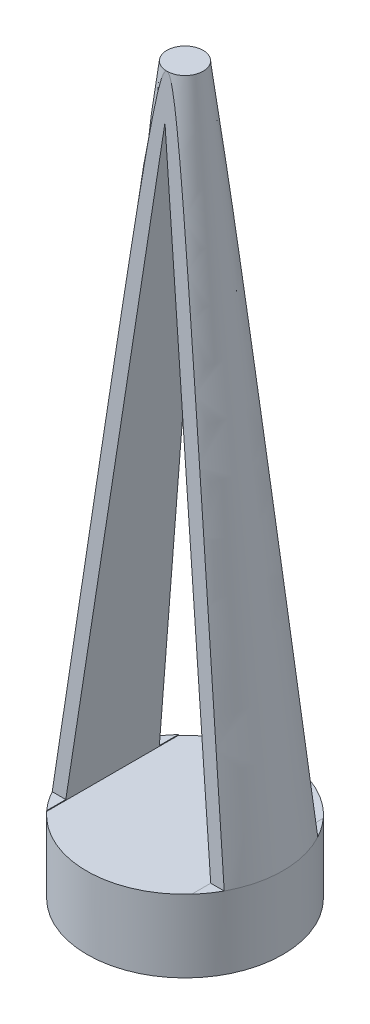
ISO-10303-21;
HEADER;
FILE_DESCRIPTION(('STEP AP214'),'2;1');
FILE_NAME('part.step','',(''),(''),'','','');
FILE_SCHEMA(('AUTOMOTIVE_DESIGN { 1 0 10303 214 1 1 1 1 }'));
ENDSEC;
DATA;
#1=APPLICATION_CONTEXT('core data for automotive mechanical design processes');
#2=APPLICATION_PROTOCOL_DEFINITION('international standard','automotive_design',2000,#1);
#3=PRODUCT_CONTEXT('',#1,'mechanical');
#4=PRODUCT('Part','Part','',(#3));
#5=PRODUCT_RELATED_PRODUCT_CATEGORY('part','',(#4));
#6=PRODUCT_DEFINITION_FORMATION('','',#4);
#7=PRODUCT_DEFINITION_CONTEXT('part definition',#1,'design');
#8=PRODUCT_DEFINITION('design','',#6,#7);
#9=PRODUCT_DEFINITION_SHAPE('','',#8);
#10=(LENGTH_UNIT() NAMED_UNIT(*) SI_UNIT(.MILLI.,.METRE.));
#11=(NAMED_UNIT(*) PLANE_ANGLE_UNIT() SI_UNIT($,.RADIAN.));
#12=(NAMED_UNIT(*) SI_UNIT($,.STERADIAN.) SOLID_ANGLE_UNIT());
#13=UNCERTAINTY_MEASURE_WITH_UNIT(LENGTH_MEASURE(1.E-05),#10,'distance_accuracy_value','');
#14=(GEOMETRIC_REPRESENTATION_CONTEXT(3) GLOBAL_UNCERTAINTY_ASSIGNED_CONTEXT((#13)) GLOBAL_UNIT_ASSIGNED_CONTEXT((#10,
#11,#12)) REPRESENTATION_CONTEXT('',''));
#15=CARTESIAN_POINT('',(0.,0.,0.));
#16=DIRECTION('',(0.,0.,1.));
#17=DIRECTION('',(1.,0.,0.));
#18=AXIS2_PLACEMENT_3D('',#15,#16,#17);
#19=CARTESIAN_POINT('',(-13.5,10.,-29.4519829234393));
#20=DIRECTION('',(0.,-1.,0.));
#21=DIRECTION('',(0.,0.,-1.));
#22=AXIS2_PLACEMENT_3D('',#19,#20,#21);
#23=PLANE('',#22);
#24=DIRECTION('',(1.,0.,0.));
#25=VECTOR('',#24,1.);
#26=CARTESIAN_POINT('',(-13.5,10.,-6.45198292343925));
#27=LINE('',#26,#25);
#28=CARTESIAN_POINT('',(-11.8584112070567,10.,-6.45198292343925));
#29=VERTEX_POINT('',#28);
#30=CARTESIAN_POINT('',(-9.98661612270126,10.,-6.45198292343925));
#31=VERTEX_POINT('',#30);
#32=EDGE_CURVE('E184',#29,#31,#27,.T.);
#33=ORIENTED_EDGE('',*,*,#32,.T.);
#34=DIRECTION('',(0.,0.,-1.));
#35=VECTOR('',#34,1.);
#36=CARTESIAN_POINT('',(-9.98661612270127,10.,-29.4519829234393));
#37=LINE('',#36,#35);
#38=CARTESIAN_POINT('',(-9.98661612270127,10.,-9.08391426741815));
#39=VERTEX_POINT('',#38);
#40=EDGE_CURVE('E221',#31,#39,#37,.T.);
#41=ORIENTED_EDGE('',*,*,#40,.T.);
#42=CARTESIAN_POINT('',(0.,10.,0.));
#43=DIRECTION('',(0.,-1.,0.));
#44=DIRECTION('',(0.,0.,-1.));
#45=AXIS2_PLACEMENT_3D('',#42,#43,#44);
#46=CIRCLE('',#45,13.5);
#47=EDGE_CURVE('E137',#29,#39,#46,.T.);
#48=ORIENTED_EDGE('',*,*,#47,.F.);
#49=EDGE_LOOP('',(#33,#41,#48));
#50=FACE_BOUND('',#49,.T.);
#51=ADVANCED_FACE('F43',(#50),#23,.F.);
#52=CARTESIAN_POINT('',(-13.5,10.,29.4519829234393));
#53=DIRECTION('',(0.,-1.,0.));
#54=DIRECTION('',(0.,0.,-1.));
#55=AXIS2_PLACEMENT_3D('',#52,#53,#54);
#56=PLANE('',#55);
#57=CARTESIAN_POINT('',(-9.98661612270127,10.,9.08391426741815));
#58=VERTEX_POINT('',#57);
#59=CARTESIAN_POINT('',(-11.8584112070567,10.,6.45198292343925));
#60=VERTEX_POINT('',#59);
#61=EDGE_CURVE('E140',#58,#60,#46,.T.);
#62=ORIENTED_EDGE('',*,*,#61,.F.);
#63=DIRECTION('',(0.,0.,-1.));
#64=VECTOR('',#63,1.);
#65=CARTESIAN_POINT('',(-9.98661612270127,10.,29.4519829234393));
#66=LINE('',#65,#64);
#67=CARTESIAN_POINT('',(-9.98661612270127,10.,6.45198292343925));
#68=VERTEX_POINT('',#67);
#69=EDGE_CURVE('E11',#58,#68,#66,.T.);
#70=ORIENTED_EDGE('',*,*,#69,.T.);
#71=DIRECTION('',(1.,0.,0.));
#72=VECTOR('',#71,1.);
#73=CARTESIAN_POINT('',(-13.5,10.,6.45198292343925));
#74=LINE('',#73,#72);
#75=EDGE_CURVE('E171',#60,#68,#74,.T.);
#76=ORIENTED_EDGE('',*,*,#75,.F.);
#77=EDGE_LOOP('',(#62,#70,#76));
#78=FACE_BOUND('',#77,.T.);
#79=ADVANCED_FACE('F214',(#78),#56,.F.);
#80=CARTESIAN_POINT('',(0.,100.,0.));
#81=DIRECTION('',(0.,-1.,0.));
#82=DIRECTION('',(0.,0.,-1.));
#83=AXIS2_PLACEMENT_3D('',#80,#81,#82);
#84=CONICAL_SURFACE('',#83,2.5,0.121619023261347);
#85=EDGE_CURVE('E142',#60,#29,#46,.T.);
#86=ORIENTED_EDGE('',*,*,#85,.F.);
#87=CARTESIAN_POINT('',(-11.8584342571506,9.9998,6.45199170562352));
#88=CARTESIAN_POINT('',(-11.6285408480214,11.9945069191554,6.36440228693721));
#89=CARTESIAN_POINT('',(-11.3985168669059,13.9891988268268,6.27681352741899));
#90=CARTESIAN_POINT('',(-10.9381327907331,17.9786383406804,6.10163356260962));
#91=CARTESIAN_POINT('',(-10.7077726804772,19.973385945112,6.01404235739534));
#92=CARTESIAN_POINT('',(-10.2474197232843,23.9562877971518,5.83914946733983));
#93=CARTESIAN_POINT('',(-10.0174281533141,25.9444421920318,5.75184777603176));
#94=CARTESIAN_POINT('',(-9.55697719471043,29.9206032342618,5.57725088114579));
#95=CARTESIAN_POINT('',(-9.32651782832233,31.9086098841836,5.48995567745496));
#96=CARTESIAN_POINT('',(-8.67837746132275,37.4924836504869,5.24476263555417));
#97=CARTESIAN_POINT('',(-8.26003349439677,41.0882740672214,5.08686816529638));
#98=CARTESIAN_POINT('',(-7.63023601028722,46.4820170177257,4.85002394269845));
#99=CARTESIAN_POINT('',(-7.41990451208157,48.2801002984779,4.77106844913784));
#100=CARTESIAN_POINT('',(-6.9982687357099,51.8761489496317,4.61316263956877));
#101=CARTESIAN_POINT('',(-6.78696445974724,53.6741143202909,4.53421232354899));
#102=CARTESIAN_POINT('',(-6.36199535206681,57.2790837030713,4.37591479643488));
#103=CARTESIAN_POINT('',(-6.14832397532452,59.0860869454905,4.29656761913889));
#104=CARTESIAN_POINT('',(-5.71922936018165,62.6999016715271,4.13788168485255));
#105=CARTESIAN_POINT('',(-5.50380610686704,64.5067131533792,4.05854292793974));
#106=CARTESIAN_POINT('',(-5.07063502718311,68.118827562796,3.89993165612281));
#107=CARTESIAN_POINT('',(-4.85288885882153,69.9241306886695,3.82065913251076));
#108=CARTESIAN_POINT('',(-4.41378265301205,73.5342435673284,3.66213574975356));
#109=CARTESIAN_POINT('',(-4.19242272698438,75.3390533335871,3.58288489001677));
#110=CARTESIAN_POINT('',(-3.85566042407418,78.0487620551712,3.4638990834035));
#111=CARTESIAN_POINT('',(-3.74242592382784,78.9539297306058,3.42415233677943));
#112=CARTESIAN_POINT('',(-3.51401970206015,80.7641039962184,3.34466591693332));
#113=CARTESIAN_POINT('',(-3.39884780785029,81.6691105646925,3.30492624466431));
#114=CARTESIAN_POINT('',(-3.16566944592479,83.480690558555,3.22537809799555));
#115=CARTESIAN_POINT('',(-3.04765753617785,84.3872632857954,3.18556965425211));
#116=CARTESIAN_POINT('',(-2.80803882862327,86.1996607524699,3.10598561159897));
#117=CARTESIAN_POINT('',(-2.68643311929754,87.1054856346751,3.06621000642007));
#118=CARTESIAN_POINT('',(-2.50062685684623,88.4587839389358,3.00678543098943));
#119=CARTESIAN_POINT('',(-2.43847484233686,88.9065378665049,2.98712414348214));
#120=CARTESIAN_POINT('',(-2.31249078210079,89.8018272865451,2.94781116015398));
#121=CARTESIAN_POINT('',(-2.24865867379907,90.2493627702462,2.9281594647182));
#122=CARTESIAN_POINT('',(-2.11877749243549,91.1446225470556,2.88884778305161));
#123=CARTESIAN_POINT('',(-2.05272602945693,91.5923464953287,2.86918781196284));
#124=CARTESIAN_POINT('',(-1.91778233647481,92.4873078072887,2.82988923616278));
#125=CARTESIAN_POINT('',(-1.84889048119476,92.9345452272219,2.81025062898168));
#126=CARTESIAN_POINT('',(-1.70749613503853,93.8264924398709,2.77108440505948));
#127=CARTESIAN_POINT('',(-1.63501037896266,94.2712048521742,2.75155667328988));
#128=CARTESIAN_POINT('',(-1.52196367177021,94.9376598614447,2.72229201978013));
#129=CARTESIAN_POINT('',(-1.48355140640092,95.1597658465747,2.71253914133094));
#130=CARTESIAN_POINT('',(-1.40491521708824,95.6036500027683,2.69304777905024));
#131=CARTESIAN_POINT('',(-1.3646913647335,95.8254281864286,2.68330929466561));
#132=CARTESIAN_POINT('',(-1.28199748194456,96.2680903639752,2.6638715905932));
#133=CARTESIAN_POINT('',(-1.23953229637111,96.4889752582893,2.65417233136682));
#134=CARTESIAN_POINT('',(-1.15149066699462,96.9301690618391,2.63479910494953));
#135=CARTESIAN_POINT('',(-1.10591373704144,97.1504778754652,2.62512514195693));
#136=CARTESIAN_POINT('',(-1.01038935068411,97.5899503824088,2.60582749925958));
#137=CARTESIAN_POINT('',(-0.960445677782289,97.8091148960627,2.59620378353309));
#138=CARTESIAN_POINT('',(-0.853918418984521,98.2458176465807,2.57702776339235));
#139=CARTESIAN_POINT('',(-0.797337200733368,98.463356434074,2.56747543479947));
#140=CARTESIAN_POINT('',(-0.72428678025953,98.7153022999458,2.55641225969329));
#141=CARTESIAN_POINT('',(-0.713641129294059,98.7513905164255,2.55482759285701));
#142=CARTESIAN_POINT('',(-0.691952134781309,98.8234489523897,2.55166344054123));
#143=CARTESIAN_POINT('',(-0.680908776681683,98.8594191675037,2.55008395525364));
#144=CARTESIAN_POINT('',(-0.647097148272669,98.9671626079836,2.54535284151043));
#145=CARTESIAN_POINT('',(-0.623659121844415,99.0387274855673,2.54221036179788));
#146=CARTESIAN_POINT('',(-0.57412687294838,99.1818406695297,2.53592613002968));
#147=CARTESIAN_POINT('',(-0.548006098347438,99.2533800073746,2.5327847717906));
#148=CARTESIAN_POINT('',(-0.492306555973057,99.3949861190377,2.52656671695563));
#149=CARTESIAN_POINT('',(-0.462732407240674,99.4650547152573,2.52348994033642));
#150=CARTESIAN_POINT('',(-0.39767272984239,99.6040190072779,2.51738789023605));
#151=CARTESIAN_POINT('',(-0.362097833829897,99.6728763579273,2.51436430052583));
#152=CARTESIAN_POINT('',(-0.301257468105687,99.7709181480175,2.51005919519005));
#153=CARTESIAN_POINT('',(-0.279918756372832,99.8025063346347,2.50867212881123));
#154=CARTESIAN_POINT('',(-0.233496548336692,99.8627557307301,2.50602652231661));
#155=CARTESIAN_POINT('',(-0.208435436411657,99.8914328199158,2.50476728490821));
#156=CARTESIAN_POINT('',(-0.169713127804961,99.9269025624142,2.50320977583429));
#157=CARTESIAN_POINT('',(-0.158497162325428,99.9363232852227,2.50279610321578));
#158=CARTESIAN_POINT('',(-0.135035967100917,99.9538525065294,2.50202637895728));
#159=CARTESIAN_POINT('',(-0.122789330666709,99.9619591659418,2.50167040807324));
#160=CARTESIAN_POINT('',(-0.0970342477735006,99.9763984548121,2.50103636559499));
#161=CARTESIAN_POINT('',(-0.083510609018077,99.9827048170474,2.50075944741874));
#162=CARTESIAN_POINT('',(-0.0555105771865756,99.9926257436817,2.50032381038937));
#163=CARTESIAN_POINT('',(-0.0410374085742732,99.9962489520258,2.50016471197266));
#164=CARTESIAN_POINT('',(-0.0151389908621096,99.9997366238917,2.50001156508758));
#165=CARTESIAN_POINT('',(-0.00380598946014141,100.000289285298,2.49998729721601));
#166=CARTESIAN_POINT('',(0.018785679637718,99.9994241786875,2.50002528484438));
#167=CARTESIAN_POINT('',(0.0300443369705516,99.9980061415602,2.50008755216118));
#168=CARTESIAN_POINT('',(0.0521111669882821,99.9933762495125,2.50029085498684));
#169=CARTESIAN_POINT('',(0.0629214370777905,99.9901740845759,2.50043146499959));
#170=CARTESIAN_POINT('',(0.0839768223260764,99.982282982852,2.50077797054692));
#171=CARTESIAN_POINT('',(0.0942215534646088,99.9775930500511,2.50098390981738));
#172=CARTESIAN_POINT('',(0.121856701870732,99.962923181784,2.50162807724939));
#173=CARTESIAN_POINT('',(0.138567333635558,99.9516751189981,2.50212199004996));
#174=CARTESIAN_POINT('',(0.170164400017073,99.9268566695979,2.50321179103014));
#175=CARTESIAN_POINT('',(0.185043640504509,99.9132775966435,2.50380806063494));
#176=CARTESIAN_POINT('',(0.238408080709174,99.8594492947993,2.50617171096478));
#177=CARTESIAN_POINT('',(0.272054333219058,99.8145404225363,2.50814370092361));
#178=CARTESIAN_POINT('',(0.333441317838563,99.7208810119222,2.51225637193879));
#179=CARTESIAN_POINT('',(0.361137650452189,99.6721050739159,2.51439816831741));
#180=CARTESIAN_POINT('',(0.414863503217922,99.5685266898205,2.51894639059721));
#181=CARTESIAN_POINT('',(0.440573609760954,99.5135569417164,2.52136016288402));
#182=CARTESIAN_POINT('',(0.489085745937005,99.4023389887671,2.52624384567109));
#183=CARTESIAN_POINT('',(0.511885028996051,99.3460896346141,2.5287138066385));
#184=CARTESIAN_POINT('',(0.577299577011346,99.1759085485072,2.53618661492947));
#185=CARTESIAN_POINT('',(0.616814713172568,99.0607923384259,2.54124147377893));
#186=CARTESIAN_POINT('',(0.691042301670075,98.8289698436222,2.55142101312042));
#187=CARTESIAN_POINT('',(0.725750185828485,98.7122621606699,2.55654575500999));
#188=CARTESIAN_POINT('',(0.791802912239096,98.4780989960488,2.56682807531978));
#189=CARTESIAN_POINT('',(0.823152878399683,98.3606449520109,2.5719855906123));
#190=CARTESIAN_POINT('',(0.91305583806449,98.009856828207,2.58738902033472));
#191=CARTESIAN_POINT('',(0.968191147609912,97.775656825406,2.59767295824293));
#192=CARTESIAN_POINT('',(1.07296469282629,97.3060186777441,2.618295202018));
#193=CARTESIAN_POINT('',(1.1226018902829,97.0705803078033,2.62863351776831));
#194=CARTESIAN_POINT('',(1.21814593003481,96.5986869542158,2.64935478971345));
#195=CARTESIAN_POINT('',(1.26404866859506,96.3622311449885,2.65973778216027));
#196=CARTESIAN_POINT('',(1.35310673664148,95.8888276954807,2.68052536380863));
#197=CARTESIAN_POINT('',(1.39626228739751,95.6518800964024,2.69092995120094));
#198=CARTESIAN_POINT('',(1.48039389017522,95.1781206368491,2.71173316557841));
#199=CARTESIAN_POINT('',(1.52137438656278,94.941309561307,2.72213175809645));
#200=CARTESIAN_POINT('',(1.60169850014491,94.4674065773131,2.74294127476434));
#201=CARTESIAN_POINT('',(1.64104208456994,94.2303146633368,2.75335219915679));
#202=CARTESIAN_POINT('',(1.71838662039047,93.7560386932564,2.7741780939874));
#203=CARTESIAN_POINT('',(1.75638825559499,93.5188547482095,2.78459305954895));
#204=CARTESIAN_POINT('',(1.83130005693493,93.0443171542799,2.80543044252384));
#205=CARTESIAN_POINT('',(1.86821023153121,92.8069635067274,2.81585285987876));
#206=CARTESIAN_POINT('',(1.9774660158891,92.0954332101122,2.84709681078691));
#207=CARTESIAN_POINT('',(2.04845604826969,91.6210488030337,2.86792746718602));
#208=CARTESIAN_POINT('',(2.18779407600312,90.671892121929,2.90960581157929));
#209=CARTESIAN_POINT('',(2.25614205437892,90.1971198454305,2.930453499682));
#210=CARTESIAN_POINT('',(2.45820641614634,88.7723615940312,2.99301594723266));
#211=CARTESIAN_POINT('',(2.58894025326383,87.8219539672511,3.03474922180312));
#212=CARTESIAN_POINT('',(2.84548289605772,85.9202269357448,3.11825580795374));
#213=CARTESIAN_POINT('',(2.97129039569663,84.9689073568187,3.16002912718317));
#214=CARTESIAN_POINT('',(3.21949621059495,83.0658368292434,3.24359470748404));
#215=CARTESIAN_POINT('',(3.34189456715148,82.1140858859616,3.28538696831979));
#216=CARTESIAN_POINT('',(3.5843118856437,80.2098137408085,3.36900531275563));
#217=CARTESIAN_POINT('',(3.70432966569164,79.2572923891818,3.41083140293163));
#218=CARTESIAN_POINT('',(3.94253944513253,77.3520191744001,3.49449370525723));
#219=CARTESIAN_POINT('',(4.06073143892861,76.3992673105476,3.53632991743745));
#220=CARTESIAN_POINT('',(4.41320503374214,73.540952336915,3.66184116149975));
#221=CARTESIAN_POINT('',(4.6454090112968,71.6351337299524,3.74552741249851));
#222=CARTESIAN_POINT('',(5.16248995580306,67.3589309000977,3.93329941872905));
#223=CARTESIAN_POINT('',(5.44642385673114,64.9884332240238,4.03739015579457));
#224=CARTESIAN_POINT('',(6.01097919642145,60.2470427833411,4.24558897862719));
#225=CARTESIAN_POINT('',(6.29160063230283,57.8761500183906,4.3496970644093));
#226=CARTESIAN_POINT('',(6.85064303092841,53.13401910378,4.55792840213435));
#227=CARTESIAN_POINT('',(7.12906391391702,50.7627809447451,4.66205165448894));
#228=CARTESIAN_POINT('',(7.68435153964632,46.0201229453935,4.87030613699061));
#229=CARTESIAN_POINT('',(7.96121828226833,43.648703105063,4.97443736713829));
#230=CARTESIAN_POINT('',(8.79003796641072,36.535193176843,5.28679814227208));
#231=CARTESIAN_POINT('',(9.34032121507048,31.7929089926743,5.49503621020464));
#232=CARTESIAN_POINT('',(10.4383344331721,22.3080847056459,5.91152358369529));
#233=CARTESIAN_POINT('',(10.9860644231462,17.5655446051555,6.11977288914934));
#234=CARTESIAN_POINT('',(11.5872338470483,12.352397691803,6.34868697335988));
#235=CARTESIAN_POINT('',(11.641484330945,11.8818841929439,6.36934765461253));
#236=CARTESIAN_POINT('',(11.7499705106425,10.9408474226328,6.4106694462414));
#237=CARTESIAN_POINT('',(11.8042062061774,10.4703241511504,6.43133055661895));
#238=CARTESIAN_POINT('',(11.8584342571506,9.9998,6.45199170562352));
#239=B_SPLINE_CURVE_WITH_KNOTS('',3,(#87,#88,#89,#90,#91,#92,#93,#94,#95,#96,#97,#98,#99,#100,
#101,#102,#103,#104,#105,#106,#107,#108,#109,#110,#111,#112,#113,#114,#115,#116,#117,#118,#119,
#120,#121,#122,#123,#124,#125,#126,#127,#128,#129,#130,#131,#132,#133,#134,#135,#136,#137,#138,
#139,#140,#141,#142,#143,#144,#145,#146,#147,#148,#149,#150,#151,#152,#153,#154,#155,#156,#157,
#158,#159,#160,#161,#162,#163,#164,#165,#166,#167,#168,#169,#170,#171,#172,#173,#174,#175,#176,
#177,#178,#179,#180,#181,#182,#183,#184,#185,#186,#187,#188,#189,#190,#191,#192,#193,#194,#195,
#196,#197,#198,#199,#200,#201,#202,#203,#204,#205,#206,#207,#208,#209,#210,#211,#212,#213,#214,
#215,#216,#217,#218,#219,#220,#221,#222,#223,#224,#225,#226,#227,#228,#229,#230,#231,#232,#233,
#234,#235,#236,#237,#238),.UNSPECIFIED.,.F.,.F.,(4,2,2,2,2,2,2,2,2,2,2,2,2,2,2,2,2,2,2,2,2,2,2,
2,2,2,2,2,2,2,2,2,2,2,2,2,2,2,2,2,2,2,2,2,2,2,2,2,2,2,2,2,2,2,2,2,2,2,2,2,2,2,2,2,2,2,2,2,2,2,2,
2,2,2,2,4),(0.,6.0294616086733,12.0592048649111,18.0691532608147,24.0788222603635,
34.9492793699482,40.3854718898463,45.8216521026621,51.2856161494098,56.7496267606028,
62.2099684560234,67.6701421136806,70.4094057997221,73.1489149560203,75.8941739761178,
78.6386098720322,79.9960304718524,81.3535017004754,82.7124847812964,84.0712891461148,
85.4242715879971,86.1011082355621,86.777918159937,87.4533206601439,88.1288289215156,
88.8037575909489,89.4784462379238,89.5914211965834,89.7044002932739,89.9304869693796,
90.1590785676903,90.3873678432629,90.6194183947717,90.7337369824873,90.8473940460538,
90.8912842122446,90.935235283848,90.979798196729,91.0242169153604,91.058089074393,
91.0919658593145,91.1256604208414,91.1593775875861,91.2194722595868,91.2797959343182,
91.4469056333957,91.6152220661747,91.7972454592715,91.9794393549186,92.3446494326485,
92.7102042111081,93.0751929883613,93.7975309224952,94.520005024771,95.243262609656,
95.9664618664845,96.6881214967129,97.4097955669877,98.1310964298531,98.8523916998197,
100.292736327699,101.733090209256,104.613858003556,107.495384427095,110.376875929677,
113.25976390622,116.142660718389,121.907860766028,129.076986523246,136.246118515005,
143.415509160113,150.584900352644,164.920829497687,179.256643159768,180.67888659268,
182.101154102895),.UNSPECIFIED.);
#240=CARTESIAN_POINT('',(0.,100.,2.5));
#241=VERTEX_POINT('',#240);
#242=EDGE_CURVE('E144',#60,#241,#239,.T.);
#243=ORIENTED_EDGE('',*,*,#242,.T.);
#244=CARTESIAN_POINT('',(0.,100.,0.));
#245=DIRECTION('',(0.,-1.,0.));
#246=DIRECTION('',(0.,0.,-1.));
#247=AXIS2_PLACEMENT_3D('',#244,#245,#246);
#248=CIRCLE('',#247,2.5);
#249=CARTESIAN_POINT('',(0.,100.,-2.5));
#250=VERTEX_POINT('',#249);
#251=EDGE_CURVE('E148',#241,#250,#248,.T.);
#252=ORIENTED_EDGE('',*,*,#251,.T.);
#253=CARTESIAN_POINT('',(11.8584342571506,9.9998,-6.45199170562352));
#254=CARTESIAN_POINT('',(11.6285408480214,11.9945069191554,-6.36440228693721));
#255=CARTESIAN_POINT('',(11.3985168669059,13.9891988268268,-6.27681352741899));
#256=CARTESIAN_POINT('',(10.9381327907331,17.9786383406804,-6.10163356260962));
#257=CARTESIAN_POINT('',(10.7077726804772,19.973385945112,-6.01404235739534));
#258=CARTESIAN_POINT('',(10.2474197232843,23.9562877971518,-5.83914946733983));
#259=CARTESIAN_POINT('',(10.0174281533141,25.9444421920318,-5.75184777603176));
#260=CARTESIAN_POINT('',(9.55697719471043,29.9206032342618,-5.57725088114579));
#261=CARTESIAN_POINT('',(9.32651782832233,31.9086098841836,-5.48995567745496));
#262=CARTESIAN_POINT('',(8.67837746132275,37.4924836504869,-5.24476263555417));
#263=CARTESIAN_POINT('',(8.26003349439677,41.0882740672214,-5.08686816529638));
#264=CARTESIAN_POINT('',(7.63023601028722,46.4820170177257,-4.85002394269845));
#265=CARTESIAN_POINT('',(7.41990451208157,48.2801002984779,-4.77106844913784));
#266=CARTESIAN_POINT('',(6.9982687357099,51.8761489496317,-4.61316263956877));
#267=CARTESIAN_POINT('',(6.78696445974724,53.6741143202909,-4.53421232354899));
#268=CARTESIAN_POINT('',(6.36199535206681,57.2790837030713,-4.37591479643488));
#269=CARTESIAN_POINT('',(6.14832397532452,59.0860869454905,-4.29656761913889));
#270=CARTESIAN_POINT('',(5.71922936018165,62.6999016715271,-4.13788168485255));
#271=CARTESIAN_POINT('',(5.50380610686704,64.5067131533792,-4.05854292793974));
#272=CARTESIAN_POINT('',(5.07063502718311,68.118827562796,-3.89993165612281));
#273=CARTESIAN_POINT('',(4.85288885882153,69.9241306886695,-3.82065913251076));
#274=CARTESIAN_POINT('',(4.41378265301205,73.5342435673284,-3.66213574975356));
#275=CARTESIAN_POINT('',(4.19242272698438,75.3390533335871,-3.58288489001677));
#276=CARTESIAN_POINT('',(3.85566042407418,78.0487620551712,-3.4638990834035));
#277=CARTESIAN_POINT('',(3.74242592382784,78.9539297306058,-3.42415233677943));
#278=CARTESIAN_POINT('',(3.51401970206015,80.7641039962184,-3.34466591693332));
#279=CARTESIAN_POINT('',(3.39884780785029,81.6691105646925,-3.30492624466431));
#280=CARTESIAN_POINT('',(3.16566944592479,83.480690558555,-3.22537809799555));
#281=CARTESIAN_POINT('',(3.04765753617785,84.3872632857954,-3.18556965425211));
#282=CARTESIAN_POINT('',(2.80803882862327,86.1996607524699,-3.10598561159897));
#283=CARTESIAN_POINT('',(2.68643311929754,87.1054856346751,-3.06621000642007));
#284=CARTESIAN_POINT('',(2.50062685684623,88.4587839389358,-3.00678543098943));
#285=CARTESIAN_POINT('',(2.43847484233686,88.9065378665049,-2.98712414348214));
#286=CARTESIAN_POINT('',(2.31249078210079,89.8018272865451,-2.94781116015398));
#287=CARTESIAN_POINT('',(2.24865867379907,90.2493627702462,-2.9281594647182));
#288=CARTESIAN_POINT('',(2.11877749243549,91.1446225470556,-2.88884778305161));
#289=CARTESIAN_POINT('',(2.05272602945693,91.5923464953287,-2.86918781196284));
#290=CARTESIAN_POINT('',(1.91778233647481,92.4873078072887,-2.82988923616278));
#291=CARTESIAN_POINT('',(1.84889048119476,92.9345452272219,-2.81025062898168));
#292=CARTESIAN_POINT('',(1.70749613503853,93.8264924398709,-2.77108440505948));
#293=CARTESIAN_POINT('',(1.63501037896266,94.2712048521742,-2.75155667328988));
#294=CARTESIAN_POINT('',(1.52196367177021,94.9376598614447,-2.72229201978013));
#295=CARTESIAN_POINT('',(1.48355140640092,95.1597658465747,-2.71253914133094));
#296=CARTESIAN_POINT('',(1.40491521708824,95.6036500027683,-2.69304777905024));
#297=CARTESIAN_POINT('',(1.3646913647335,95.8254281864286,-2.68330929466561));
#298=CARTESIAN_POINT('',(1.28199748194456,96.2680903639752,-2.6638715905932));
#299=CARTESIAN_POINT('',(1.23953229637111,96.4889752582893,-2.65417233136682));
#300=CARTESIAN_POINT('',(1.15149066699462,96.9301690618391,-2.63479910494953));
#301=CARTESIAN_POINT('',(1.10591373704144,97.1504778754652,-2.62512514195693));
#302=CARTESIAN_POINT('',(1.01038935068411,97.5899503824088,-2.60582749925958));
#303=CARTESIAN_POINT('',(0.960445677782289,97.8091148960627,-2.59620378353309));
#304=CARTESIAN_POINT('',(0.853918418984521,98.2458176465807,-2.57702776339235));
#305=CARTESIAN_POINT('',(0.797337200733368,98.463356434074,-2.56747543479947));
#306=CARTESIAN_POINT('',(0.72428678025953,98.7153022999458,-2.55641225969329));
#307=CARTESIAN_POINT('',(0.713641129294059,98.7513905164255,-2.55482759285701));
#308=CARTESIAN_POINT('',(0.691952134781309,98.8234489523897,-2.55166344054123));
#309=CARTESIAN_POINT('',(0.680908776681683,98.8594191675037,-2.55008395525364));
#310=CARTESIAN_POINT('',(0.647097148272669,98.9671626079836,-2.54535284151043));
#311=CARTESIAN_POINT('',(0.623659121844415,99.0387274855673,-2.54221036179788));
#312=CARTESIAN_POINT('',(0.57412687294838,99.1818406695297,-2.53592613002968));
#313=CARTESIAN_POINT('',(0.548006098347438,99.2533800073746,-2.5327847717906));
#314=CARTESIAN_POINT('',(0.492306555973057,99.3949861190377,-2.52656671695563));
#315=CARTESIAN_POINT('',(0.462732407240674,99.4650547152573,-2.52348994033642));
#316=CARTESIAN_POINT('',(0.39767272984239,99.6040190072779,-2.51738789023605));
#317=CARTESIAN_POINT('',(0.362097833829897,99.6728763579273,-2.51436430052583));
#318=CARTESIAN_POINT('',(0.301257468105687,99.7709181480175,-2.51005919519005));
#319=CARTESIAN_POINT('',(0.279918756372832,99.8025063346347,-2.50867212881123));
#320=CARTESIAN_POINT('',(0.233496548336692,99.8627557307301,-2.50602652231661));
#321=CARTESIAN_POINT('',(0.208435436411657,99.8914328199158,-2.50476728490821));
#322=CARTESIAN_POINT('',(0.169713127804961,99.9269025624142,-2.50320977583429));
#323=CARTESIAN_POINT('',(0.158497162325428,99.9363232852227,-2.50279610321578));
#324=CARTESIAN_POINT('',(0.135035967100917,99.9538525065294,-2.50202637895728));
#325=CARTESIAN_POINT('',(0.122789330666709,99.9619591659418,-2.50167040807324));
#326=CARTESIAN_POINT('',(0.0970342477735006,99.9763984548121,-2.50103636559499));
#327=CARTESIAN_POINT('',(0.083510609018077,99.9827048170474,-2.50075944741874));
#328=CARTESIAN_POINT('',(0.0555105771865756,99.9926257436817,-2.50032381038937));
#329=CARTESIAN_POINT('',(0.0410374085742732,99.9962489520258,-2.50016471197266));
#330=CARTESIAN_POINT('',(0.0151389908621096,99.9997366238917,-2.50001156508758));
#331=CARTESIAN_POINT('',(0.00380598946014141,100.000289285298,-2.49998729721601));
#332=CARTESIAN_POINT('',(-0.018785679637718,99.9994241786875,-2.50002528484438));
#333=CARTESIAN_POINT('',(-0.0300443369705516,99.9980061415602,-2.50008755216118));
#334=CARTESIAN_POINT('',(-0.0521111669882821,99.9933762495125,-2.50029085498684));
#335=CARTESIAN_POINT('',(-0.0629214370777905,99.9901740845759,-2.50043146499959));
#336=CARTESIAN_POINT('',(-0.0839768223260764,99.982282982852,-2.50077797054692));
#337=CARTESIAN_POINT('',(-0.0942215534646088,99.9775930500511,-2.50098390981738));
#338=CARTESIAN_POINT('',(-0.121856701870732,99.962923181784,-2.50162807724939));
#339=CARTESIAN_POINT('',(-0.138567333635558,99.9516751189981,-2.50212199004996));
#340=CARTESIAN_POINT('',(-0.170164400017073,99.9268566695979,-2.50321179103014));
#341=CARTESIAN_POINT('',(-0.185043640504509,99.9132775966435,-2.50380806063494));
#342=CARTESIAN_POINT('',(-0.238408080709174,99.8594492947993,-2.50617171096478));
#343=CARTESIAN_POINT('',(-0.272054333219058,99.8145404225363,-2.50814370092361));
#344=CARTESIAN_POINT('',(-0.333441317838563,99.7208810119222,-2.51225637193879));
#345=CARTESIAN_POINT('',(-0.361137650452189,99.6721050739159,-2.51439816831741));
#346=CARTESIAN_POINT('',(-0.414863503217922,99.5685266898205,-2.51894639059721));
#347=CARTESIAN_POINT('',(-0.440573609760954,99.5135569417164,-2.52136016288402));
#348=CARTESIAN_POINT('',(-0.489085745937005,99.4023389887671,-2.52624384567109));
#349=CARTESIAN_POINT('',(-0.511885028996051,99.3460896346141,-2.5287138066385));
#350=CARTESIAN_POINT('',(-0.577299577011346,99.1759085485072,-2.53618661492947));
#351=CARTESIAN_POINT('',(-0.616814713172568,99.0607923384259,-2.54124147377893));
#352=CARTESIAN_POINT('',(-0.691042301670075,98.8289698436222,-2.55142101312042));
#353=CARTESIAN_POINT('',(-0.725750185828485,98.7122621606699,-2.55654575500999));
#354=CARTESIAN_POINT('',(-0.791802912239096,98.4780989960488,-2.56682807531978));
#355=CARTESIAN_POINT('',(-0.823152878399683,98.3606449520109,-2.5719855906123));
#356=CARTESIAN_POINT('',(-0.91305583806449,98.009856828207,-2.58738902033472));
#357=CARTESIAN_POINT('',(-0.968191147609912,97.775656825406,-2.59767295824293));
#358=CARTESIAN_POINT('',(-1.07296469282629,97.3060186777441,-2.618295202018));
#359=CARTESIAN_POINT('',(-1.1226018902829,97.0705803078033,-2.62863351776831));
#360=CARTESIAN_POINT('',(-1.21814593003481,96.5986869542158,-2.64935478971345));
#361=CARTESIAN_POINT('',(-1.26404866859506,96.3622311449885,-2.65973778216027));
#362=CARTESIAN_POINT('',(-1.35310673664148,95.8888276954807,-2.68052536380863));
#363=CARTESIAN_POINT('',(-1.39626228739751,95.6518800964024,-2.69092995120094));
#364=CARTESIAN_POINT('',(-1.48039389017522,95.1781206368491,-2.71173316557841));
#365=CARTESIAN_POINT('',(-1.52137438656278,94.941309561307,-2.72213175809645));
#366=CARTESIAN_POINT('',(-1.60169850014491,94.4674065773131,-2.74294127476434));
#367=CARTESIAN_POINT('',(-1.64104208456994,94.2303146633368,-2.75335219915679));
#368=CARTESIAN_POINT('',(-1.71838662039047,93.7560386932564,-2.7741780939874));
#369=CARTESIAN_POINT('',(-1.75638825559499,93.5188547482095,-2.78459305954895));
#370=CARTESIAN_POINT('',(-1.83130005693493,93.0443171542799,-2.80543044252384));
#371=CARTESIAN_POINT('',(-1.86821023153121,92.8069635067274,-2.81585285987876));
#372=CARTESIAN_POINT('',(-1.9774660158891,92.0954332101122,-2.84709681078691));
#373=CARTESIAN_POINT('',(-2.04845604826969,91.6210488030337,-2.86792746718602));
#374=CARTESIAN_POINT('',(-2.18779407600312,90.671892121929,-2.90960581157929));
#375=CARTESIAN_POINT('',(-2.25614205437892,90.1971198454305,-2.930453499682));
#376=CARTESIAN_POINT('',(-2.45820641614634,88.7723615940312,-2.99301594723266));
#377=CARTESIAN_POINT('',(-2.58894025326383,87.8219539672511,-3.03474922180312));
#378=CARTESIAN_POINT('',(-2.84548289605772,85.9202269357448,-3.11825580795374));
#379=CARTESIAN_POINT('',(-2.97129039569663,84.9689073568187,-3.16002912718317));
#380=CARTESIAN_POINT('',(-3.21949621059495,83.0658368292434,-3.24359470748404));
#381=CARTESIAN_POINT('',(-3.34189456715148,82.1140858859616,-3.28538696831979));
#382=CARTESIAN_POINT('',(-3.5843118856437,80.2098137408085,-3.36900531275563));
#383=CARTESIAN_POINT('',(-3.70432966569164,79.2572923891818,-3.41083140293163));
#384=CARTESIAN_POINT('',(-3.94253944513253,77.3520191744001,-3.49449370525723));
#385=CARTESIAN_POINT('',(-4.06073143892861,76.3992673105476,-3.53632991743745));
#386=CARTESIAN_POINT('',(-4.41320503374214,73.540952336915,-3.66184116149975));
#387=CARTESIAN_POINT('',(-4.6454090112968,71.6351337299524,-3.74552741249851));
#388=CARTESIAN_POINT('',(-5.16248995580306,67.3589309000977,-3.93329941872905));
#389=CARTESIAN_POINT('',(-5.44642385673114,64.9884332240238,-4.03739015579457));
#390=CARTESIAN_POINT('',(-6.01097919642145,60.2470427833411,-4.24558897862719));
#391=CARTESIAN_POINT('',(-6.29160063230283,57.8761500183906,-4.3496970644093));
#392=CARTESIAN_POINT('',(-6.85064303092841,53.13401910378,-4.55792840213435));
#393=CARTESIAN_POINT('',(-7.12906391391702,50.7627809447451,-4.66205165448894));
#394=CARTESIAN_POINT('',(-7.68435153964632,46.0201229453935,-4.87030613699061));
#395=CARTESIAN_POINT('',(-7.96121828226833,43.648703105063,-4.97443736713829));
#396=CARTESIAN_POINT('',(-8.79003796641072,36.535193176843,-5.28679814227208));
#397=CARTESIAN_POINT('',(-9.34032121507048,31.7929089926743,-5.49503621020464));
#398=CARTESIAN_POINT('',(-10.4383344331721,22.3080847056459,-5.91152358369529));
#399=CARTESIAN_POINT('',(-10.9860644231462,17.5655446051555,-6.11977288914934));
#400=CARTESIAN_POINT('',(-11.5872338470483,12.352397691803,-6.34868697335988));
#401=CARTESIAN_POINT('',(-11.641484330945,11.8818841929439,-6.36934765461253));
#402=CARTESIAN_POINT('',(-11.7499705106425,10.9408474226328,-6.4106694462414));
#403=CARTESIAN_POINT('',(-11.8042062061774,10.4703241511504,-6.43133055661895));
#404=CARTESIAN_POINT('',(-11.8584342571506,9.9998,-6.45199170562352));
#405=B_SPLINE_CURVE_WITH_KNOTS('',3,(#253,#254,#255,#256,#257,#258,#259,#260,#261,#262,#263,
#264,#265,#266,#267,#268,#269,#270,#271,#272,#273,#274,#275,#276,#277,#278,#279,#280,#281,#282,
#283,#284,#285,#286,#287,#288,#289,#290,#291,#292,#293,#294,#295,#296,#297,#298,#299,#300,#301,
#302,#303,#304,#305,#306,#307,#308,#309,#310,#311,#312,#313,#314,#315,#316,#317,#318,#319,#320,
#321,#322,#323,#324,#325,#326,#327,#328,#329,#330,#331,#332,#333,#334,#335,#336,#337,#338,#339,
#340,#341,#342,#343,#344,#345,#346,#347,#348,#349,#350,#351,#352,#353,#354,#355,#356,#357,#358,
#359,#360,#361,#362,#363,#364,#365,#366,#367,#368,#369,#370,#371,#372,#373,#374,#375,#376,#377,
#378,#379,#380,#381,#382,#383,#384,#385,#386,#387,#388,#389,#390,#391,#392,#393,#394,#395,#396,
#397,#398,#399,#400,#401,#402,#403,#404),.UNSPECIFIED.,.F.,.F.,(4,2,2,2,2,2,2,2,2,2,2,2,2,2,2,2,
2,2,2,2,2,2,2,2,2,2,2,2,2,2,2,2,2,2,2,2,2,2,2,2,2,2,2,2,2,2,2,2,2,2,2,2,2,2,2,2,2,2,2,2,2,2,2,2,
2,2,2,2,2,2,2,2,2,2,2,4),(0.,6.0294616086733,12.0592048649111,18.0691532608147,24.0788222603635,
34.9492793699482,40.3854718898463,45.8216521026621,51.2856161494098,56.7496267606028,
62.2099684560234,67.6701421136806,70.4094057997221,73.1489149560203,75.8941739761178,
78.6386098720322,79.9960304718524,81.3535017004754,82.7124847812964,84.0712891461148,
85.4242715879971,86.1011082355621,86.777918159937,87.4533206601439,88.1288289215156,
88.8037575909489,89.4784462379238,89.5914211965834,89.7044002932739,89.9304869693796,
90.1590785676903,90.3873678432629,90.6194183947717,90.7337369824873,90.8473940460538,
90.8912842122446,90.935235283848,90.979798196729,91.0242169153604,91.058089074393,
91.0919658593145,91.1256604208414,91.1593775875861,91.2194722595868,91.2797959343182,
91.4469056333957,91.6152220661747,91.7972454592715,91.9794393549186,92.3446494326485,
92.7102042111081,93.0751929883613,93.7975309224952,94.520005024771,95.243262609656,
95.9664618664845,96.6881214967129,97.4097955669877,98.1310964298531,98.8523916998197,
100.292736327699,101.733090209256,104.613858003556,107.495384427095,110.376875929677,
113.25976390622,116.142660718389,121.907860766028,129.076986523246,136.246118515005,
143.415509160113,150.584900352644,164.920829497687,179.256643159768,180.67888659268,
182.101154102895),.UNSPECIFIED.);
#406=EDGE_CURVE('E165',#250,#29,#405,.T.);
#407=ORIENTED_EDGE('',*,*,#406,.T.);
#408=EDGE_LOOP('',(#86,#243,#252,#407));
#409=FACE_BOUND('',#408,.T.);
#410=ADVANCED_FACE('F162',(#409),#84,.T.);
#411=CARTESIAN_POINT('',(0.,100.,0.));
#412=DIRECTION('',(0.,-1.,0.));
#413=DIRECTION('',(0.,0.,-1.));
#414=AXIS2_PLACEMENT_3D('',#411,#412,#413);
#415=PLANE('',#414);
#416=EDGE_CURVE('E152',#250,#241,#248,.T.);
#417=ORIENTED_EDGE('',*,*,#416,.F.);
#418=ORIENTED_EDGE('',*,*,#251,.F.);
#419=EDGE_LOOP('',(#417,#418));
#420=FACE_BOUND('',#419,.T.);
#421=ADVANCED_FACE('F45',(#420),#415,.F.);
#422=ORIENTED_EDGE('',*,*,#416,.T.);
#423=CARTESIAN_POINT('',(11.8584112070567,10.,6.45198292343925));
#424=VERTEX_POINT('',#423);
#425=EDGE_CURVE('E173',#241,#424,#239,.T.);
#426=ORIENTED_EDGE('',*,*,#425,.T.);
#427=CARTESIAN_POINT('',(11.8584112070567,10.,-6.45198292343925));
#428=VERTEX_POINT('',#427);
#429=EDGE_CURVE('E141',#428,#424,#46,.T.);
#430=ORIENTED_EDGE('',*,*,#429,.F.);
#431=EDGE_CURVE('E170',#428,#250,#405,.T.);
#432=ORIENTED_EDGE('',*,*,#431,.T.);
#433=EDGE_LOOP('',(#422,#426,#430,#432));
#434=FACE_BOUND('',#433,.T.);
#435=ADVANCED_FACE('F190',(#434),#84,.T.);
#436=CARTESIAN_POINT('',(0.,0.,0.));
#437=DIRECTION('',(0.,-1.,0.));
#438=DIRECTION('',(0.,0.,-1.));
#439=AXIS2_PLACEMENT_3D('',#436,#437,#438);
#440=CYLINDRICAL_SURFACE('',#439,13.5);
#441=CARTESIAN_POINT('',(0.,0.,0.));
#442=DIRECTION('',(0.,-1.,0.));
#443=DIRECTION('',(0.,0.,-1.));
#444=AXIS2_PLACEMENT_3D('',#441,#442,#443);
#445=CIRCLE('',#444,13.5);
#446=CARTESIAN_POINT('',(0.,0.,-13.5));
#447=VERTEX_POINT('',#446);
#448=EDGE_CURVE('E138',#447,#447,#445,.T.);
#449=ORIENTED_EDGE('',*,*,#448,.F.);
#450=EDGE_LOOP('',(#449));
#451=FACE_BOUND('',#450,.T.);
#452=ORIENTED_EDGE('',*,*,#47,.T.);
#453=CARTESIAN_POINT('',(0.,93.9905553966053,0.));
#454=DIRECTION('',(-0.99300527779613,0.118069971919332,0.));
#455=DIRECTION('',(-0.118069971919332,-0.99300527779613,0.));
#456=AXIS2_PLACEMENT_3D('',#453,#454,#455);
#457=ELLIPSE('',#456,114.338978662784,13.5);
#458=CARTESIAN_POINT('',(-10.,9.88743741885449,-9.06917857360852));
#459=VERTEX_POINT('',#458);
#460=EDGE_CURVE('E121',#39,#459,#457,.T.);
#461=ORIENTED_EDGE('',*,*,#460,.T.);
#462=CARTESIAN_POINT('',(0.,9.94371870942724,0.));
#463=DIRECTION('',(0.00562803992154475,-0.999984162457907,0.));
#464=DIRECTION('',(-0.999984162457907,-0.00562803992154475,0.));
#465=AXIS2_PLACEMENT_3D('',#462,#463,#464);
#466=ELLIPSE('',#465,13.5002138102045,13.5);
#467=CARTESIAN_POINT('',(10.,10.,-9.06917857360853));
#468=VERTEX_POINT('',#467);
#469=EDGE_CURVE('E113',#459,#468,#466,.T.);
#470=ORIENTED_EDGE('',*,*,#469,.T.);
#471=EDGE_CURVE('E119',#468,#428,#46,.T.);
#472=ORIENTED_EDGE('',*,*,#471,.T.);
#473=ORIENTED_EDGE('',*,*,#429,.T.);
#474=CARTESIAN_POINT('',(9.99999999999999,10.,9.06917857360853));
#475=VERTEX_POINT('',#474);
#476=EDGE_CURVE('E147',#424,#475,#46,.T.);
#477=ORIENTED_EDGE('',*,*,#476,.T.);
#478=CARTESIAN_POINT('',(-10.,9.88743741885449,9.06917857360853));
#479=VERTEX_POINT('',#478);
#480=EDGE_CURVE('E66',#475,#479,#466,.T.);
#481=ORIENTED_EDGE('',*,*,#480,.T.);
#482=EDGE_CURVE('E224',#479,#58,#457,.T.);
#483=ORIENTED_EDGE('',*,*,#482,.T.);
#484=ORIENTED_EDGE('',*,*,#61,.T.);
#485=ORIENTED_EDGE('',*,*,#85,.T.);
#486=EDGE_LOOP('',(#452,#461,#470,#472,#473,#477,#481,#483,#484,#485));
#487=FACE_BOUND('',#486,.T.);
#488=ADVANCED_FACE('F116',(#451,#487),#440,.T.);
#489=CARTESIAN_POINT('',(-13.5,0.,0.));
#490=DIRECTION('',(0.,1.,0.));
#491=DIRECTION('',(0.,0.,1.));
#492=AXIS2_PLACEMENT_3D('',#489,#490,#491);
#493=PLANE('',#492);
#494=ORIENTED_EDGE('',*,*,#448,.T.);
#495=EDGE_LOOP('',(#494));
#496=FACE_BOUND('',#495,.T.);
#497=ADVANCED_FACE('F202',(#496),#493,.F.);
#498=ORIENTED_EDGE('',*,*,#471,.F.);
#499=DIRECTION('',(0.,0.,1.));
#500=VECTOR('',#499,1.);
#501=CARTESIAN_POINT('',(10.,10.,-13.5));
#502=LINE('',#501,#500);
#503=CARTESIAN_POINT('',(10.,10.,-6.45198292343925));
#504=VERTEX_POINT('',#503);
#505=EDGE_CURVE('E127',#468,#504,#502,.T.);
#506=ORIENTED_EDGE('',*,*,#505,.T.);
#507=EDGE_CURVE('E135',#504,#428,#27,.T.);
#508=ORIENTED_EDGE('',*,*,#507,.T.);
#509=EDGE_LOOP('',(#498,#506,#508));
#510=FACE_BOUND('',#509,.T.);
#511=ADVANCED_FACE('F134',(#510),#23,.F.);
#512=CARTESIAN_POINT('',(-13.5,100.,-2.5));
#513=DIRECTION('',(0.,-0.0438686486544218,0.999037307444139));
#514=DIRECTION('',(0.,-0.999037307444139,-0.0438686486544218));
#515=AXIS2_PLACEMENT_3D('',#512,#513,#514);
#516=PLANE('',#515);
#517=DIRECTION('',(-0.118113770134895,0.992044115361685,0.0435615711467531));
#518=VECTOR('',#517,1.);
#519=CARTESIAN_POINT('',(-0.893845454953905,101.498013016636,-2.43422086821293));
#520=LINE('',#519,#518);
#521=CARTESIAN_POINT('',(0.,93.9905553966053,-2.76388024946633));
#522=VERTEX_POINT('',#521);
#523=EDGE_CURVE('E232',#504,#522,#520,.T.);
#524=ORIENTED_EDGE('',*,*,#523,.T.);
#525=DIRECTION('',(-0.117957889130881,-0.992062626598091,-0.0435623839921994));
#526=VECTOR('',#525,1.);
#527=CARTESIAN_POINT('',(0.516750999680448,98.3365924257298,-2.57304175920261));
#528=LINE('',#527,#526);
#529=EDGE_CURVE('E225',#522,#31,#528,.T.);
#530=ORIENTED_EDGE('',*,*,#529,.T.);
#531=ORIENTED_EDGE('',*,*,#32,.F.);
#532=ORIENTED_EDGE('',*,*,#406,.F.);
#533=ORIENTED_EDGE('',*,*,#431,.F.);
#534=ORIENTED_EDGE('',*,*,#507,.F.);
#535=EDGE_LOOP('',(#524,#530,#531,#532,#533,#534));
#536=FACE_BOUND('',#535,.T.);
#537=ADVANCED_FACE('F193',(#536),#516,.F.);
#538=CARTESIAN_POINT('',(-13.5,100.,2.5));
#539=DIRECTION('',(0.,-0.0438686486544218,-0.999037307444139));
#540=DIRECTION('',(0.,0.999037307444139,-0.0438686486544218));
#541=AXIS2_PLACEMENT_3D('',#538,#539,#540);
#542=PLANE('',#541);
#543=ORIENTED_EDGE('',*,*,#75,.T.);
#544=DIRECTION('',(0.117957889130881,0.992062626598091,-0.0435623839921994));
#545=VECTOR('',#544,1.);
#546=CARTESIAN_POINT('',(0.516750999680448,98.3365924257298,2.57304175920261));
#547=LINE('',#546,#545);
#548=CARTESIAN_POINT('',(0.,93.9905553966053,2.76388024946633));
#549=VERTEX_POINT('',#548);
#550=EDGE_CURVE('E229',#68,#549,#547,.T.);
#551=ORIENTED_EDGE('',*,*,#550,.T.);
#552=DIRECTION('',(0.118113770134895,-0.992044115361685,0.0435615711467531));
#553=VECTOR('',#552,1.);
#554=CARTESIAN_POINT('',(-0.893845454953905,101.498013016636,2.43422086821293));
#555=LINE('',#554,#553);
#556=CARTESIAN_POINT('',(10.,10.,6.45198292343925));
#557=VERTEX_POINT('',#556);
#558=EDGE_CURVE('E123',#549,#557,#555,.T.);
#559=ORIENTED_EDGE('',*,*,#558,.T.);
#560=EDGE_CURVE('E175',#557,#424,#74,.T.);
#561=ORIENTED_EDGE('',*,*,#560,.T.);
#562=ORIENTED_EDGE('',*,*,#425,.F.);
#563=ORIENTED_EDGE('',*,*,#242,.F.);
#564=EDGE_LOOP('',(#543,#551,#559,#561,#562,#563));
#565=FACE_BOUND('',#564,.T.);
#566=ADVANCED_FACE('F198',(#565),#542,.F.);
#567=ORIENTED_EDGE('',*,*,#560,.F.);
#568=DIRECTION('',(0.,0.,1.));
#569=VECTOR('',#568,1.);
#570=CARTESIAN_POINT('',(10.,10.,29.4519829234393));
#571=LINE('',#570,#569);
#572=EDGE_CURVE('E51',#557,#475,#571,.T.);
#573=ORIENTED_EDGE('',*,*,#572,.T.);
#574=ORIENTED_EDGE('',*,*,#476,.F.);
#575=EDGE_LOOP('',(#567,#573,#574));
#576=FACE_BOUND('',#575,.T.);
#577=ADVANCED_FACE('F199',(#576),#56,.F.);
#578=CARTESIAN_POINT('',(0.,93.9905553966053,-13.5));
#579=DIRECTION('',(-0.99300527779613,0.118069971919332,0.));
#580=DIRECTION('',(-0.118069971919332,-0.99300527779613,0.));
#581=AXIS2_PLACEMENT_3D('',#578,#579,#580);
#582=PLANE('',#581);
#583=ORIENTED_EDGE('',*,*,#40,.F.);
#584=ORIENTED_EDGE('',*,*,#529,.F.);
#585=DIRECTION('',(0.,0.,1.));
#586=VECTOR('',#585,1.);
#587=CARTESIAN_POINT('',(0.,93.9905553966053,-13.5));
#588=LINE('',#587,#586);
#589=EDGE_CURVE('E58',#522,#549,#588,.T.);
#590=ORIENTED_EDGE('',*,*,#589,.T.);
#591=ORIENTED_EDGE('',*,*,#550,.F.);
#592=ORIENTED_EDGE('',*,*,#69,.F.);
#593=ORIENTED_EDGE('',*,*,#482,.F.);
#594=DIRECTION('',(0.,0.,1.));
#595=VECTOR('',#594,1.);
#596=CARTESIAN_POINT('',(-10.,9.88743741885449,-13.5));
#597=LINE('',#596,#595);
#598=EDGE_CURVE('E239',#459,#479,#597,.T.);
#599=ORIENTED_EDGE('',*,*,#598,.F.);
#600=ORIENTED_EDGE('',*,*,#460,.F.);
#601=EDGE_LOOP('',(#583,#584,#590,#591,#592,#593,#599,#600));
#602=FACE_BOUND('',#601,.T.);
#603=ADVANCED_FACE('F242',(#602),#582,.F.);
#604=CARTESIAN_POINT('',(10.,10.,-13.5));
#605=DIRECTION('',(0.992986713742801,0.11822599684618,0.));
#606=DIRECTION('',(-0.11822599684618,0.992986713742801,0.));
#607=AXIS2_PLACEMENT_3D('',#604,#605,#606);
#608=PLANE('',#607);
#609=EDGE_CURVE('E130',#504,#557,#502,.T.);
#610=ORIENTED_EDGE('',*,*,#609,.T.);
#611=ORIENTED_EDGE('',*,*,#558,.F.);
#612=ORIENTED_EDGE('',*,*,#589,.F.);
#613=ORIENTED_EDGE('',*,*,#523,.F.);
#614=EDGE_LOOP('',(#610,#611,#612,#613));
#615=FACE_BOUND('',#614,.T.);
#616=ADVANCED_FACE('F248',(#615),#608,.F.);
#617=CARTESIAN_POINT('',(-10.,9.88743741885449,-13.5));
#618=DIRECTION('',(0.00562803992154475,-0.999984162457907,0.));
#619=DIRECTION('',(0.999984162457907,0.00562803992154475,0.));
#620=AXIS2_PLACEMENT_3D('',#617,#618,#619);
#621=PLANE('',#620);
#622=ORIENTED_EDGE('',*,*,#598,.T.);
#623=ORIENTED_EDGE('',*,*,#480,.F.);
#624=ORIENTED_EDGE('',*,*,#572,.F.);
#625=ORIENTED_EDGE('',*,*,#609,.F.);
#626=ORIENTED_EDGE('',*,*,#505,.F.);
#627=ORIENTED_EDGE('',*,*,#469,.F.);
#628=EDGE_LOOP('',(#622,#623,#624,#625,#626,#627));
#629=FACE_BOUND('',#628,.T.);
#630=ADVANCED_FACE('F128',(#629),#621,.F.);
#631=CLOSED_SHELL('',(#51,#79,#410,#421,#435,#488,#497,#511,#537,#566,#577,#603,#616,#630));
#632=MANIFOLD_SOLID_BREP('B2',#631);
#633=ADVANCED_BREP_SHAPE_REPRESENTATION('',(#18,#632),#14);
#634=SHAPE_DEFINITION_REPRESENTATION(#9,#633);
ENDSEC;
END-ISO-10303-21;
